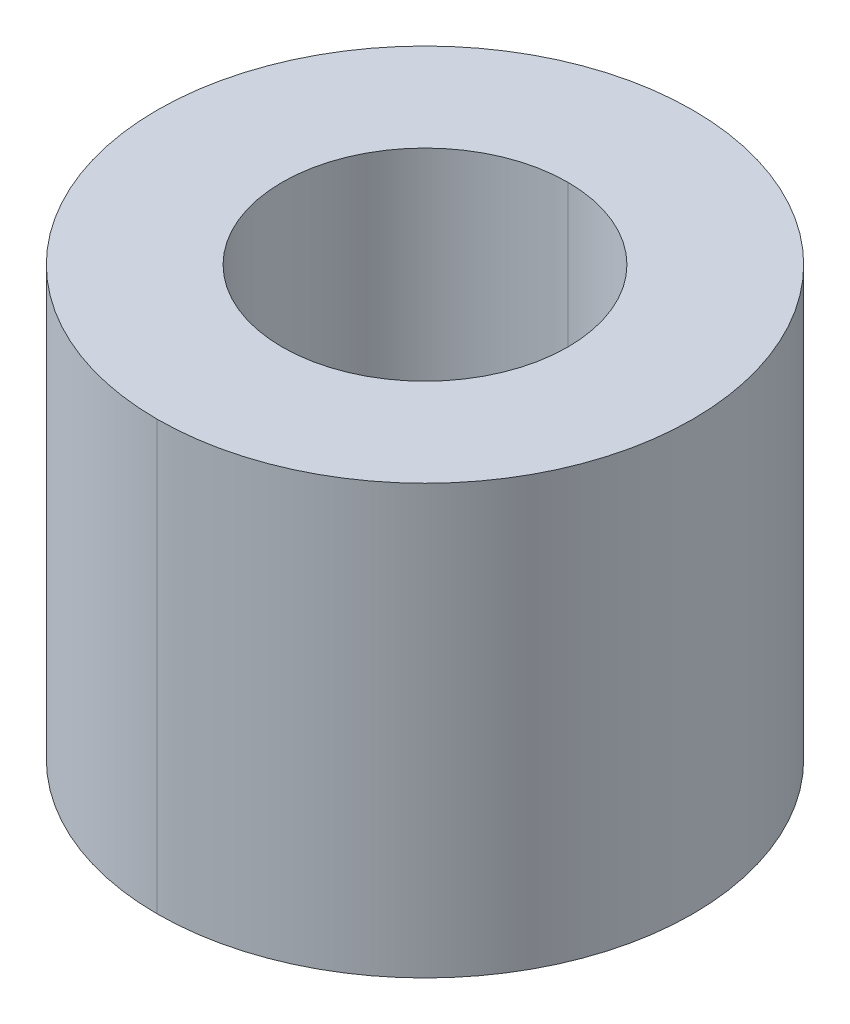
ISO-10303-21;
HEADER;
FILE_DESCRIPTION(('STEP AP214'),'2;1');
FILE_NAME('part.step','',(''),(''),'','','');
FILE_SCHEMA(('AUTOMOTIVE_DESIGN { 1 0 10303 214 1 1 1 1 }'));
ENDSEC;
DATA;
#1=APPLICATION_CONTEXT('core data for automotive mechanical design processes');
#2=APPLICATION_PROTOCOL_DEFINITION('international standard','automotive_design',2000,#1);
#3=PRODUCT_CONTEXT('',#1,'mechanical');
#4=PRODUCT('Part','Part','',(#3));
#5=PRODUCT_RELATED_PRODUCT_CATEGORY('part','',(#4));
#6=PRODUCT_DEFINITION_FORMATION('','',#4);
#7=PRODUCT_DEFINITION_CONTEXT('part definition',#1,'design');
#8=PRODUCT_DEFINITION('design','',#6,#7);
#9=PRODUCT_DEFINITION_SHAPE('','',#8);
#10=(LENGTH_UNIT() NAMED_UNIT(*) SI_UNIT(.MILLI.,.METRE.));
#11=(NAMED_UNIT(*) PLANE_ANGLE_UNIT() SI_UNIT($,.RADIAN.));
#12=(NAMED_UNIT(*) SI_UNIT($,.STERADIAN.) SOLID_ANGLE_UNIT());
#13=UNCERTAINTY_MEASURE_WITH_UNIT(LENGTH_MEASURE(1.E-05),#10,'distance_accuracy_value','');
#14=(GEOMETRIC_REPRESENTATION_CONTEXT(3) GLOBAL_UNCERTAINTY_ASSIGNED_CONTEXT((#13)) GLOBAL_UNIT_ASSIGNED_CONTEXT((#10,
#11,#12)) REPRESENTATION_CONTEXT('',''));
#15=CARTESIAN_POINT('',(0.,0.,0.));
#16=DIRECTION('',(0.,0.,1.));
#17=DIRECTION('',(1.,0.,0.));
#18=AXIS2_PLACEMENT_3D('',#15,#16,#17);
#19=CARTESIAN_POINT('',(0.,0.,0.));
#20=DIRECTION('',(0.,1.,0.));
#21=DIRECTION('',(0.,0.,-1.));
#22=AXIS2_PLACEMENT_3D('',#19,#20,#21);
#23=CYLINDRICAL_SURFACE('',#22,4.);
#24=DIRECTION('',(0.,1.,0.));
#25=VECTOR('',#24,1.);
#26=CARTESIAN_POINT('',(0.,5.,-4.));
#27=LINE('',#26,#25);
#28=CARTESIAN_POINT('',(0.,5.,-4.));
#29=VERTEX_POINT('',#28);
#30=CARTESIAN_POINT('',(0.,12.,-4.));
#31=VERTEX_POINT('',#30);
#32=EDGE_CURVE('E21',#29,#31,#27,.T.);
#33=ORIENTED_EDGE('',*,*,#32,.F.);
#34=CARTESIAN_POINT('',(0.,5.,0.));
#35=DIRECTION('',(0.,1.,0.));
#36=DIRECTION('',(0.,0.,1.));
#37=AXIS2_PLACEMENT_3D('',#34,#35,#36);
#38=CIRCLE('',#37,4.);
#39=CARTESIAN_POINT('',(0.,5.,4.));
#40=VERTEX_POINT('',#39);
#41=EDGE_CURVE('E98',#40,#29,#38,.T.);
#42=ORIENTED_EDGE('',*,*,#41,.F.);
#43=DIRECTION('',(0.,1.,0.));
#44=VECTOR('',#43,1.);
#45=CARTESIAN_POINT('',(0.,5.,4.));
#46=LINE('',#45,#44);
#47=CARTESIAN_POINT('',(0.,12.,4.));
#48=VERTEX_POINT('',#47);
#49=EDGE_CURVE('E91',#40,#48,#46,.T.);
#50=ORIENTED_EDGE('',*,*,#49,.T.);
#51=CARTESIAN_POINT('',(0.,12.,0.));
#52=DIRECTION('',(0.,-1.,0.));
#53=DIRECTION('',(0.,0.,-1.));
#54=AXIS2_PLACEMENT_3D('',#51,#52,#53);
#55=CIRCLE('',#54,4.);
#56=EDGE_CURVE('E75',#31,#48,#55,.T.);
#57=ORIENTED_EDGE('',*,*,#56,.F.);
#58=EDGE_LOOP('',(#33,#42,#50,#57));
#59=FACE_BOUND('',#58,.T.);
#60=ADVANCED_FACE('F17',(#59),#23,.F.);
#61=CARTESIAN_POINT('',(0.,0.,0.));
#62=DIRECTION('',(0.,1.,0.));
#63=DIRECTION('',(0.,0.,-1.));
#64=AXIS2_PLACEMENT_3D('',#61,#62,#63);
#65=CYLINDRICAL_SURFACE('',#64,2.75);
#66=DIRECTION('',(0.,1.,0.));
#67=VECTOR('',#66,1.);
#68=CARTESIAN_POINT('',(0.,0.,-2.75));
#69=LINE('',#68,#67);
#70=CARTESIAN_POINT('',(0.,0.,-2.75));
#71=VERTEX_POINT('',#70);
#72=CARTESIAN_POINT('',(0.,5.,-2.75));
#73=VERTEX_POINT('',#72);
#74=EDGE_CURVE('E11',#71,#73,#69,.T.);
#75=ORIENTED_EDGE('',*,*,#74,.F.);
#76=CARTESIAN_POINT('',(0.,0.,0.));
#77=DIRECTION('',(0.,1.,0.));
#78=DIRECTION('',(0.,0.,1.));
#79=AXIS2_PLACEMENT_3D('',#76,#77,#78);
#80=CIRCLE('',#79,2.75);
#81=CARTESIAN_POINT('',(0.,0.,2.75));
#82=VERTEX_POINT('',#81);
#83=EDGE_CURVE('E125',#82,#71,#80,.T.);
#84=ORIENTED_EDGE('',*,*,#83,.F.);
#85=DIRECTION('',(0.,1.,0.));
#86=VECTOR('',#85,1.);
#87=CARTESIAN_POINT('',(0.,0.,2.75));
#88=LINE('',#87,#86);
#89=CARTESIAN_POINT('',(0.,5.,2.75));
#90=VERTEX_POINT('',#89);
#91=EDGE_CURVE('E28',#82,#90,#88,.T.);
#92=ORIENTED_EDGE('',*,*,#91,.T.);
#93=CARTESIAN_POINT('',(0.,5.,0.));
#94=DIRECTION('',(0.,-1.,0.));
#95=DIRECTION('',(0.,0.,-1.));
#96=AXIS2_PLACEMENT_3D('',#93,#94,#95);
#97=CIRCLE('',#96,2.75);
#98=EDGE_CURVE('E100',#73,#90,#97,.T.);
#99=ORIENTED_EDGE('',*,*,#98,.F.);
#100=EDGE_LOOP('',(#75,#84,#92,#99));
#101=FACE_BOUND('',#100,.T.);
#102=ADVANCED_FACE('F178',(#101),#65,.F.);
#103=CARTESIAN_POINT('',(0.,0.,0.));
#104=DIRECTION('',(0.,1.,0.));
#105=DIRECTION('',(0.,0.,-1.));
#106=AXIS2_PLACEMENT_3D('',#103,#104,#105);
#107=CYLINDRICAL_SURFACE('',#106,2.75);
#108=ORIENTED_EDGE('',*,*,#91,.F.);
#109=CARTESIAN_POINT('',(0.,0.,0.));
#110=DIRECTION('',(0.,1.,0.));
#111=DIRECTION('',(0.,0.,-1.));
#112=AXIS2_PLACEMENT_3D('',#109,#110,#111);
#113=CIRCLE('',#112,2.75);
#114=EDGE_CURVE('E133',#71,#82,#113,.T.);
#115=ORIENTED_EDGE('',*,*,#114,.F.);
#116=ORIENTED_EDGE('',*,*,#74,.T.);
#117=CARTESIAN_POINT('',(0.,5.,0.));
#118=DIRECTION('',(0.,-1.,0.));
#119=DIRECTION('',(0.,0.,1.));
#120=AXIS2_PLACEMENT_3D('',#117,#118,#119);
#121=CIRCLE('',#120,2.75);
#122=EDGE_CURVE('E107',#90,#73,#121,.T.);
#123=ORIENTED_EDGE('',*,*,#122,.F.);
#124=EDGE_LOOP('',(#108,#115,#116,#123));
#125=FACE_BOUND('',#124,.T.);
#126=ADVANCED_FACE('F184',(#125),#107,.F.);
#127=CARTESIAN_POINT('',(0.,0.,0.));
#128=DIRECTION('',(0.,1.,0.));
#129=DIRECTION('',(0.,0.,-1.));
#130=AXIS2_PLACEMENT_3D('',#127,#128,#129);
#131=CYLINDRICAL_SURFACE('',#130,7.5);
#132=DIRECTION('',(0.,1.,0.));
#133=VECTOR('',#132,1.);
#134=CARTESIAN_POINT('',(0.,0.,-7.5));
#135=LINE('',#134,#133);
#136=CARTESIAN_POINT('',(0.,0.,-7.5));
#137=VERTEX_POINT('',#136);
#138=CARTESIAN_POINT('',(0.,12.,-7.5));
#139=VERTEX_POINT('',#138);
#140=EDGE_CURVE('E127',#137,#139,#135,.T.);
#141=ORIENTED_EDGE('',*,*,#140,.T.);
#142=CARTESIAN_POINT('',(0.,12.,0.));
#143=DIRECTION('',(0.,1.,0.));
#144=DIRECTION('',(0.,0.,1.));
#145=AXIS2_PLACEMENT_3D('',#142,#143,#144);
#146=CIRCLE('',#145,7.5);
#147=CARTESIAN_POINT('',(0.,12.,7.5));
#148=VERTEX_POINT('',#147);
#149=EDGE_CURVE('E94',#148,#139,#146,.T.);
#150=ORIENTED_EDGE('',*,*,#149,.F.);
#151=DIRECTION('',(0.,1.,0.));
#152=VECTOR('',#151,1.);
#153=CARTESIAN_POINT('',(0.,0.,7.5));
#154=LINE('',#153,#152);
#155=CARTESIAN_POINT('',(0.,0.,7.5));
#156=VERTEX_POINT('',#155);
#157=EDGE_CURVE('E84',#156,#148,#154,.T.);
#158=ORIENTED_EDGE('',*,*,#157,.F.);
#159=CARTESIAN_POINT('',(0.,0.,0.));
#160=DIRECTION('',(0.,-1.,0.));
#161=DIRECTION('',(0.,0.,-1.));
#162=AXIS2_PLACEMENT_3D('',#159,#160,#161);
#163=CIRCLE('',#162,7.5);
#164=EDGE_CURVE('E137',#137,#156,#163,.T.);
#165=ORIENTED_EDGE('',*,*,#164,.F.);
#166=EDGE_LOOP('',(#141,#150,#158,#165));
#167=FACE_BOUND('',#166,.T.);
#168=ADVANCED_FACE('F158',(#167),#131,.T.);
#169=CARTESIAN_POINT('',(2.75,0.,0.));
#170=DIRECTION('',(0.,-1.,0.));
#171=DIRECTION('',(0.,0.,-1.));
#172=AXIS2_PLACEMENT_3D('',#169,#170,#171);
#173=PLANE('',#172);
#174=ORIENTED_EDGE('',*,*,#83,.T.);
#175=ORIENTED_EDGE('',*,*,#114,.T.);
#176=EDGE_LOOP('',(#174,#175));
#177=FACE_BOUND('',#176,.T.);
#178=CARTESIAN_POINT('',(0.,0.,0.));
#179=DIRECTION('',(0.,-1.,0.));
#180=DIRECTION('',(0.,0.,1.));
#181=AXIS2_PLACEMENT_3D('',#178,#179,#180);
#182=CIRCLE('',#181,7.5);
#183=EDGE_CURVE('E130',#156,#137,#182,.T.);
#184=ORIENTED_EDGE('',*,*,#183,.T.);
#185=ORIENTED_EDGE('',*,*,#164,.T.);
#186=EDGE_LOOP('',(#184,#185));
#187=FACE_BOUND('',#186,.T.);
#188=ADVANCED_FACE('F151',(#177,#187),#173,.T.);
#189=CARTESIAN_POINT('',(0.,0.,0.));
#190=DIRECTION('',(0.,1.,0.));
#191=DIRECTION('',(0.,0.,-1.));
#192=AXIS2_PLACEMENT_3D('',#189,#190,#191);
#193=CYLINDRICAL_SURFACE('',#192,7.5);
#194=ORIENTED_EDGE('',*,*,#157,.T.);
#195=CARTESIAN_POINT('',(0.,12.,0.));
#196=DIRECTION('',(0.,1.,0.));
#197=DIRECTION('',(0.,0.,-1.));
#198=AXIS2_PLACEMENT_3D('',#195,#196,#197);
#199=CIRCLE('',#198,7.5);
#200=EDGE_CURVE('E85',#139,#148,#199,.T.);
#201=ORIENTED_EDGE('',*,*,#200,.F.);
#202=ORIENTED_EDGE('',*,*,#140,.F.);
#203=ORIENTED_EDGE('',*,*,#183,.F.);
#204=EDGE_LOOP('',(#194,#201,#202,#203));
#205=FACE_BOUND('',#204,.T.);
#206=ADVANCED_FACE('F155',(#205),#193,.T.);
#207=CARTESIAN_POINT('',(7.5,12.,0.));
#208=DIRECTION('',(0.,1.,0.));
#209=DIRECTION('',(1.,0.,0.));
#210=AXIS2_PLACEMENT_3D('',#207,#208,#209);
#211=PLANE('',#210);
#212=CARTESIAN_POINT('',(0.,12.,0.));
#213=DIRECTION('',(0.,-1.,0.));
#214=DIRECTION('',(0.,0.,1.));
#215=AXIS2_PLACEMENT_3D('',#212,#213,#214);
#216=CIRCLE('',#215,4.);
#217=EDGE_CURVE('E78',#48,#31,#216,.T.);
#218=ORIENTED_EDGE('',*,*,#217,.T.);
#219=ORIENTED_EDGE('',*,*,#56,.T.);
#220=EDGE_LOOP('',(#218,#219));
#221=FACE_BOUND('',#220,.T.);
#222=ORIENTED_EDGE('',*,*,#149,.T.);
#223=ORIENTED_EDGE('',*,*,#200,.T.);
#224=EDGE_LOOP('',(#222,#223));
#225=FACE_BOUND('',#224,.T.);
#226=ADVANCED_FACE('F19',(#221,#225),#211,.T.);
#227=CARTESIAN_POINT('',(0.,0.,0.));
#228=DIRECTION('',(0.,1.,0.));
#229=DIRECTION('',(0.,0.,-1.));
#230=AXIS2_PLACEMENT_3D('',#227,#228,#229);
#231=CYLINDRICAL_SURFACE('',#230,4.);
#232=ORIENTED_EDGE('',*,*,#49,.F.);
#233=CARTESIAN_POINT('',(0.,5.,0.));
#234=DIRECTION('',(0.,1.,0.));
#235=DIRECTION('',(0.,0.,-1.));
#236=AXIS2_PLACEMENT_3D('',#233,#234,#235);
#237=CIRCLE('',#236,4.);
#238=EDGE_CURVE('E112',#29,#40,#237,.T.);
#239=ORIENTED_EDGE('',*,*,#238,.F.);
#240=ORIENTED_EDGE('',*,*,#32,.T.);
#241=ORIENTED_EDGE('',*,*,#217,.F.);
#242=EDGE_LOOP('',(#232,#239,#240,#241));
#243=FACE_BOUND('',#242,.T.);
#244=ADVANCED_FACE('F88',(#243),#231,.F.);
#245=CARTESIAN_POINT('',(4.,5.,0.));
#246=DIRECTION('',(0.,1.,0.));
#247=DIRECTION('',(1.,0.,0.));
#248=AXIS2_PLACEMENT_3D('',#245,#246,#247);
#249=PLANE('',#248);
#250=ORIENTED_EDGE('',*,*,#122,.T.);
#251=ORIENTED_EDGE('',*,*,#98,.T.);
#252=EDGE_LOOP('',(#250,#251));
#253=FACE_BOUND('',#252,.T.);
#254=ORIENTED_EDGE('',*,*,#41,.T.);
#255=ORIENTED_EDGE('',*,*,#238,.T.);
#256=EDGE_LOOP('',(#254,#255));
#257=FACE_BOUND('',#256,.T.);
#258=ADVANCED_FACE('F168',(#253,#257),#249,.T.);
#259=CLOSED_SHELL('',(#60,#102,#126,#168,#188,#206,#226,#244,#258));
#260=MANIFOLD_SOLID_BREP('B1',#259);
#261=ADVANCED_BREP_SHAPE_REPRESENTATION('',(#18,#260),#14);
#262=SHAPE_DEFINITION_REPRESENTATION(#9,#261);
ENDSEC;
END-ISO-10303-21;
